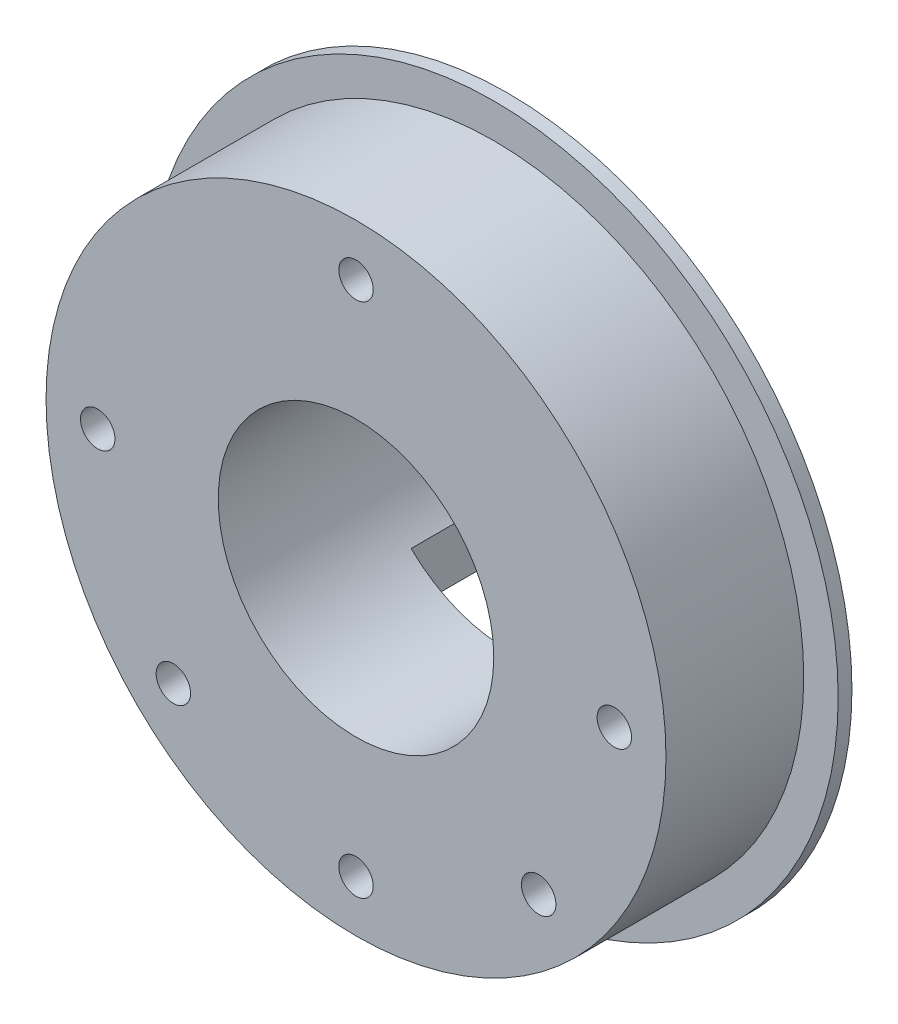
ISO-10303-21;
HEADER;
FILE_DESCRIPTION(('STEP AP214'),'2;1');
FILE_NAME('part.step','',(''),(''),'','','');
FILE_SCHEMA(('AUTOMOTIVE_DESIGN { 1 0 10303 214 1 1 1 1 }'));
ENDSEC;
DATA;
#1=APPLICATION_CONTEXT('core data for automotive mechanical design processes');
#2=APPLICATION_PROTOCOL_DEFINITION('international standard','automotive_design',2000,#1);
#3=PRODUCT_CONTEXT('',#1,'mechanical');
#4=PRODUCT('Part','Part','',(#3));
#5=PRODUCT_RELATED_PRODUCT_CATEGORY('part','',(#4));
#6=PRODUCT_DEFINITION_FORMATION('','',#4);
#7=PRODUCT_DEFINITION_CONTEXT('part definition',#1,'design');
#8=PRODUCT_DEFINITION('design','',#6,#7);
#9=PRODUCT_DEFINITION_SHAPE('','',#8);
#10=(LENGTH_UNIT() NAMED_UNIT(*) SI_UNIT(.MILLI.,.METRE.));
#11=(NAMED_UNIT(*) PLANE_ANGLE_UNIT() SI_UNIT($,.RADIAN.));
#12=(NAMED_UNIT(*) SI_UNIT($,.STERADIAN.) SOLID_ANGLE_UNIT());
#13=UNCERTAINTY_MEASURE_WITH_UNIT(LENGTH_MEASURE(1.E-05),#10,'distance_accuracy_value','');
#14=(GEOMETRIC_REPRESENTATION_CONTEXT(3) GLOBAL_UNCERTAINTY_ASSIGNED_CONTEXT((#13)) GLOBAL_UNIT_ASSIGNED_CONTEXT((#10,
#11,#12)) REPRESENTATION_CONTEXT('',''));
#15=CARTESIAN_POINT('',(0.,0.,0.));
#16=DIRECTION('',(0.,0.,1.));
#17=DIRECTION('',(1.,0.,0.));
#18=AXIS2_PLACEMENT_3D('',#15,#16,#17);
#19=CARTESIAN_POINT('',(0.,0.,8.));
#20=DIRECTION('',(0.,0.,1.));
#21=DIRECTION('',(1.,0.,0.));
#22=AXIS2_PLACEMENT_3D('',#19,#20,#21);
#23=PLANE('',#22);
#24=CARTESIAN_POINT('',(0.,0.,8.));
#25=DIRECTION('',(0.,0.,1.));
#26=DIRECTION('',(1.,0.,0.));
#27=AXIS2_PLACEMENT_3D('',#24,#25,#26);
#28=CIRCLE('',#27,22.5);
#29=CARTESIAN_POINT('',(22.5,0.,8.));
#30=VERTEX_POINT('',#29);
#31=EDGE_CURVE('E122',#30,#30,#28,.T.);
#32=ORIENTED_EDGE('',*,*,#31,.F.);
#33=EDGE_LOOP('',(#32));
#34=FACE_BOUND('',#33,.T.);
#35=CARTESIAN_POINT('',(0.,0.,8.));
#36=DIRECTION('',(0.,0.,1.));
#37=DIRECTION('',(1.,0.,0.));
#38=AXIS2_PLACEMENT_3D('',#35,#36,#37);
#39=CIRCLE('',#38,25.);
#40=CARTESIAN_POINT('',(25.,0.,8.));
#41=VERTEX_POINT('',#40);
#42=EDGE_CURVE('E260',#41,#41,#39,.T.);
#43=ORIENTED_EDGE('',*,*,#42,.T.);
#44=EDGE_LOOP('',(#43));
#45=FACE_BOUND('',#44,.T.);
#46=ADVANCED_FACE('F41',(#34,#45),#23,.T.);
#47=CARTESIAN_POINT('',(0.,0.,7.));
#48=DIRECTION('',(0.,0.,1.));
#49=DIRECTION('',(1.,0.,0.));
#50=AXIS2_PLACEMENT_3D('',#47,#48,#49);
#51=PLANE('',#50);
#52=DIRECTION('',(0.,1.,0.));
#53=VECTOR('',#52,1.);
#54=CARTESIAN_POINT('',(7.,-25.,7.));
#55=LINE('',#54,#53);
#56=CARTESIAN_POINT('',(7.,-10.9544511501033,7.));
#57=VERTEX_POINT('',#56);
#58=CARTESIAN_POINT('',(7.,-7.14142842854285,7.));
#59=VERTEX_POINT('',#58);
#60=EDGE_CURVE('E189',#57,#59,#55,.T.);
#61=ORIENTED_EDGE('',*,*,#60,.F.);
#62=CARTESIAN_POINT('',(0.,0.,7.));
#63=DIRECTION('',(0.,0.,1.));
#64=DIRECTION('',(1.,0.,0.));
#65=AXIS2_PLACEMENT_3D('',#62,#63,#64);
#66=CIRCLE('',#65,13.);
#67=CARTESIAN_POINT('',(7.,10.9544511501033,7.));
#68=VERTEX_POINT('',#67);
#69=EDGE_CURVE('E263',#57,#68,#66,.T.);
#70=ORIENTED_EDGE('',*,*,#69,.T.);
#71=CARTESIAN_POINT('',(7.,7.14142842854285,7.));
#72=VERTEX_POINT('',#71);
#73=EDGE_CURVE('E176',#72,#68,#55,.T.);
#74=ORIENTED_EDGE('',*,*,#73,.F.);
#75=CARTESIAN_POINT('',(0.,0.,7.));
#76=DIRECTION('',(0.,0.,1.));
#77=DIRECTION('',(1.,0.,0.));
#78=AXIS2_PLACEMENT_3D('',#75,#76,#77);
#79=CIRCLE('',#78,10.);
#80=CARTESIAN_POINT('',(-7.,7.14142842854285,7.));
#81=VERTEX_POINT('',#80);
#82=EDGE_CURVE('E49',#72,#81,#79,.T.);
#83=ORIENTED_EDGE('',*,*,#82,.T.);
#84=DIRECTION('',(0.,1.,0.));
#85=VECTOR('',#84,1.);
#86=CARTESIAN_POINT('',(-7.,-25.,7.));
#87=LINE('',#86,#85);
#88=CARTESIAN_POINT('',(-7.,10.9544511501033,7.));
#89=VERTEX_POINT('',#88);
#90=EDGE_CURVE('E109',#81,#89,#87,.T.);
#91=ORIENTED_EDGE('',*,*,#90,.T.);
#92=CARTESIAN_POINT('',(-7.,-10.9544511501033,7.));
#93=VERTEX_POINT('',#92);
#94=EDGE_CURVE('E265',#89,#93,#66,.T.);
#95=ORIENTED_EDGE('',*,*,#94,.T.);
#96=CARTESIAN_POINT('',(-7.,-7.14142842854285,7.));
#97=VERTEX_POINT('',#96);
#98=EDGE_CURVE('E180',#93,#97,#87,.T.);
#99=ORIENTED_EDGE('',*,*,#98,.T.);
#100=EDGE_CURVE('E121',#97,#59,#79,.T.);
#101=ORIENTED_EDGE('',*,*,#100,.T.);
#102=EDGE_LOOP('',(#61,#70,#74,#83,#91,#95,#99,#101));
#103=FACE_BOUND('',#102,.T.);
#104=CARTESIAN_POINT('',(0.,0.,7.));
#105=DIRECTION('',(0.,0.,1.));
#106=DIRECTION('',(1.,0.,0.));
#107=AXIS2_PLACEMENT_3D('',#104,#105,#106);
#108=CIRCLE('',#107,25.);
#109=CARTESIAN_POINT('',(25.,0.,7.));
#110=VERTEX_POINT('',#109);
#111=EDGE_CURVE('E258',#110,#110,#108,.T.);
#112=ORIENTED_EDGE('',*,*,#111,.F.);
#113=EDGE_LOOP('',(#112));
#114=FACE_BOUND('',#113,.T.);
#115=ADVANCED_FACE('F171',(#103,#114),#51,.F.);
#116=CARTESIAN_POINT('',(0.,0.,8.));
#117=DIRECTION('',(0.,0.,-1.));
#118=DIRECTION('',(-1.,0.,0.));
#119=AXIS2_PLACEMENT_3D('',#116,#117,#118);
#120=CYLINDRICAL_SURFACE('',#119,25.);
#121=ORIENTED_EDGE('',*,*,#42,.F.);
#122=EDGE_LOOP('',(#121));
#123=FACE_BOUND('',#122,.T.);
#124=ORIENTED_EDGE('',*,*,#111,.T.);
#125=EDGE_LOOP('',(#124));
#126=FACE_BOUND('',#125,.T.);
#127=ADVANCED_FACE('F273',(#123,#126),#120,.T.);
#128=CARTESIAN_POINT('',(0.,0.,0.));
#129=DIRECTION('',(0.,0.,1.));
#130=DIRECTION('',(1.,0.,0.));
#131=AXIS2_PLACEMENT_3D('',#128,#129,#130);
#132=PLANE('',#131);
#133=CARTESIAN_POINT('',(0.,7.,0.));
#134=DIRECTION('',(0.,0.,-1.));
#135=DIRECTION('',(-1.,0.,0.));
#136=AXIS2_PLACEMENT_3D('',#133,#134,#135);
#137=CIRCLE('',#136,1.);
#138=CARTESIAN_POINT('',(-1.,7.,0.));
#139=VERTEX_POINT('',#138);
#140=EDGE_CURVE('E141',#139,#139,#137,.T.);
#141=ORIENTED_EDGE('',*,*,#140,.F.);
#142=EDGE_LOOP('',(#141));
#143=FACE_BOUND('',#142,.T.);
#144=CARTESIAN_POINT('',(0.,0.,0.));
#145=DIRECTION('',(0.,0.,-1.));
#146=DIRECTION('',(-1.,0.,0.));
#147=AXIS2_PLACEMENT_3D('',#144,#145,#146);
#148=CIRCLE('',#147,3.);
#149=CARTESIAN_POINT('',(-3.,0.,0.));
#150=VERTEX_POINT('',#149);
#151=EDGE_CURVE('E201',#150,#150,#148,.T.);
#152=ORIENTED_EDGE('',*,*,#151,.F.);
#153=EDGE_LOOP('',(#152));
#154=FACE_BOUND('',#153,.T.);
#155=CARTESIAN_POINT('',(0.,-7.,0.));
#156=DIRECTION('',(0.,0.,-1.));
#157=DIRECTION('',(-1.,0.,0.));
#158=AXIS2_PLACEMENT_3D('',#155,#156,#157);
#159=CIRCLE('',#158,1.);
#160=CARTESIAN_POINT('',(-1.,-7.,0.));
#161=VERTEX_POINT('',#160);
#162=EDGE_CURVE('E204',#161,#161,#159,.T.);
#163=ORIENTED_EDGE('',*,*,#162,.F.);
#164=EDGE_LOOP('',(#163));
#165=FACE_BOUND('',#164,.T.);
#166=CARTESIAN_POINT('',(7.,3.,0.));
#167=DIRECTION('',(0.,0.,-1.));
#168=DIRECTION('',(-1.,0.,0.));
#169=AXIS2_PLACEMENT_3D('',#166,#167,#168);
#170=CIRCLE('',#169,1.);
#171=CARTESIAN_POINT('',(6.,3.,0.));
#172=VERTEX_POINT('',#171);
#173=EDGE_CURVE('E207',#172,#172,#170,.T.);
#174=ORIENTED_EDGE('',*,*,#173,.F.);
#175=EDGE_LOOP('',(#174));
#176=FACE_BOUND('',#175,.T.);
#177=CARTESIAN_POINT('',(7.,-3.,0.));
#178=DIRECTION('',(0.,0.,-1.));
#179=DIRECTION('',(-1.,0.,0.));
#180=AXIS2_PLACEMENT_3D('',#177,#178,#179);
#181=CIRCLE('',#180,1.);
#182=CARTESIAN_POINT('',(6.,-3.,0.));
#183=VERTEX_POINT('',#182);
#184=EDGE_CURVE('E210',#183,#183,#181,.T.);
#185=ORIENTED_EDGE('',*,*,#184,.F.);
#186=EDGE_LOOP('',(#185));
#187=FACE_BOUND('',#186,.T.);
#188=CARTESIAN_POINT('',(-7.,3.,0.));
#189=DIRECTION('',(0.,0.,-1.));
#190=DIRECTION('',(-1.,0.,0.));
#191=AXIS2_PLACEMENT_3D('',#188,#189,#190);
#192=CIRCLE('',#191,1.);
#193=CARTESIAN_POINT('',(-8.,3.,0.));
#194=VERTEX_POINT('',#193);
#195=EDGE_CURVE('E213',#194,#194,#192,.T.);
#196=ORIENTED_EDGE('',*,*,#195,.F.);
#197=EDGE_LOOP('',(#196));
#198=FACE_BOUND('',#197,.T.);
#199=CARTESIAN_POINT('',(-7.,-3.,0.));
#200=DIRECTION('',(0.,0.,-1.));
#201=DIRECTION('',(-1.,0.,0.));
#202=AXIS2_PLACEMENT_3D('',#199,#200,#201);
#203=CIRCLE('',#202,1.);
#204=CARTESIAN_POINT('',(-8.,-3.,0.));
#205=VERTEX_POINT('',#204);
#206=EDGE_CURVE('E198',#205,#205,#203,.T.);
#207=ORIENTED_EDGE('',*,*,#206,.F.);
#208=EDGE_LOOP('',(#207));
#209=FACE_BOUND('',#208,.T.);
#210=CARTESIAN_POINT('',(0.,0.,0.));
#211=DIRECTION('',(0.,0.,1.));
#212=DIRECTION('',(1.,0.,0.));
#213=AXIS2_PLACEMENT_3D('',#210,#211,#212);
#214=CIRCLE('',#213,13.);
#215=CARTESIAN_POINT('',(13.,0.,0.));
#216=VERTEX_POINT('',#215);
#217=EDGE_CURVE('E133',#216,#216,#214,.T.);
#218=ORIENTED_EDGE('',*,*,#217,.F.);
#219=EDGE_LOOP('',(#218));
#220=FACE_BOUND('',#219,.T.);
#221=ADVANCED_FACE('F271',(#143,#154,#165,#176,#187,#198,#209,#220),#132,.F.);
#222=CARTESIAN_POINT('',(0.,0.,2.));
#223=DIRECTION('',(0.,0.,-1.));
#224=DIRECTION('',(-1.,0.,0.));
#225=AXIS2_PLACEMENT_3D('',#222,#223,#224);
#226=CYLINDRICAL_SURFACE('',#225,13.);
#227=CARTESIAN_POINT('',(0.,0.,2.));
#228=DIRECTION('',(0.,0.,-1.));
#229=DIRECTION('',(-1.,0.,0.));
#230=AXIS2_PLACEMENT_3D('',#227,#228,#229);
#231=CIRCLE('',#230,13.);
#232=CARTESIAN_POINT('',(-7.,10.9544511501033,2.));
#233=VERTEX_POINT('',#232);
#234=CARTESIAN_POINT('',(7.,10.9544511501033,2.));
#235=VERTEX_POINT('',#234);
#236=EDGE_CURVE('E188',#233,#235,#231,.T.);
#237=ORIENTED_EDGE('',*,*,#236,.T.);
#238=DIRECTION('',(0.,0.,-1.));
#239=VECTOR('',#238,1.);
#240=CARTESIAN_POINT('',(7.,10.9544511501033,2.));
#241=LINE('',#240,#239);
#242=EDGE_CURVE('E192',#235,#68,#241,.F.);
#243=ORIENTED_EDGE('',*,*,#242,.T.);
#244=ORIENTED_EDGE('',*,*,#69,.F.);
#245=DIRECTION('',(0.,0.,-1.));
#246=VECTOR('',#245,1.);
#247=CARTESIAN_POINT('',(7.,-10.9544511501033,2.));
#248=LINE('',#247,#246);
#249=CARTESIAN_POINT('',(7.,-10.9544511501033,2.));
#250=VERTEX_POINT('',#249);
#251=EDGE_CURVE('E195',#57,#250,#248,.T.);
#252=ORIENTED_EDGE('',*,*,#251,.T.);
#253=CARTESIAN_POINT('',(-7.,-10.9544511501033,2.));
#254=VERTEX_POINT('',#253);
#255=EDGE_CURVE('E186',#250,#254,#231,.T.);
#256=ORIENTED_EDGE('',*,*,#255,.T.);
#257=DIRECTION('',(0.,0.,-1.));
#258=VECTOR('',#257,1.);
#259=CARTESIAN_POINT('',(-7.,-10.9544511501033,2.));
#260=LINE('',#259,#258);
#261=EDGE_CURVE('E107',#254,#93,#260,.F.);
#262=ORIENTED_EDGE('',*,*,#261,.T.);
#263=ORIENTED_EDGE('',*,*,#94,.F.);
#264=DIRECTION('',(0.,0.,-1.));
#265=VECTOR('',#264,1.);
#266=CARTESIAN_POINT('',(-7.,10.9544511501033,2.));
#267=LINE('',#266,#265);
#268=EDGE_CURVE('E179',#89,#233,#267,.T.);
#269=ORIENTED_EDGE('',*,*,#268,.T.);
#270=EDGE_LOOP('',(#237,#243,#244,#252,#256,#262,#263,#269));
#271=FACE_BOUND('',#270,.T.);
#272=ORIENTED_EDGE('',*,*,#217,.T.);
#273=EDGE_LOOP('',(#272));
#274=FACE_BOUND('',#273,.T.);
#275=ADVANCED_FACE('F43',(#271,#274),#226,.T.);
#276=CARTESIAN_POINT('',(0.,0.,18.));
#277=DIRECTION('',(0.,0.,1.));
#278=DIRECTION('',(1.,0.,0.));
#279=AXIS2_PLACEMENT_3D('',#276,#277,#278);
#280=PLANE('',#279);
#281=CARTESIAN_POINT('',(0.,18.75,18.));
#282=DIRECTION('',(0.,0.,1.));
#283=DIRECTION('',(1.,0.,0.));
#284=AXIS2_PLACEMENT_3D('',#281,#282,#283);
#285=CIRCLE('',#284,1.25);
#286=CARTESIAN_POINT('',(1.25,18.75,18.));
#287=VERTEX_POINT('',#286);
#288=EDGE_CURVE('E222',#287,#287,#285,.T.);
#289=ORIENTED_EDGE('',*,*,#288,.F.);
#290=EDGE_LOOP('',(#289));
#291=FACE_BOUND('',#290,.T.);
#292=CARTESIAN_POINT('',(18.75,0.,18.));
#293=DIRECTION('',(0.,0.,1.));
#294=DIRECTION('',(1.,0.,0.));
#295=AXIS2_PLACEMENT_3D('',#292,#293,#294);
#296=CIRCLE('',#295,1.25);
#297=CARTESIAN_POINT('',(20.,0.,18.));
#298=VERTEX_POINT('',#297);
#299=EDGE_CURVE('E225',#298,#298,#296,.T.);
#300=ORIENTED_EDGE('',*,*,#299,.F.);
#301=EDGE_LOOP('',(#300));
#302=FACE_BOUND('',#301,.T.);
#303=CARTESIAN_POINT('',(13.2582521472477,-13.2582521472478,18.));
#304=DIRECTION('',(0.,0.,1.));
#305=DIRECTION('',(1.,0.,0.));
#306=AXIS2_PLACEMENT_3D('',#303,#304,#305);
#307=CIRCLE('',#306,1.25);
#308=CARTESIAN_POINT('',(14.5082521472477,-13.2582521472478,18.));
#309=VERTEX_POINT('',#308);
#310=EDGE_CURVE('E231',#309,#309,#307,.T.);
#311=ORIENTED_EDGE('',*,*,#310,.F.);
#312=EDGE_LOOP('',(#311));
#313=FACE_BOUND('',#312,.T.);
#314=CARTESIAN_POINT('',(-1.30930550206618E-13,-18.75,18.));
#315=DIRECTION('',(0.,0.,1.));
#316=DIRECTION('',(1.,0.,0.));
#317=AXIS2_PLACEMENT_3D('',#314,#315,#316);
#318=CIRCLE('',#317,1.25);
#319=CARTESIAN_POINT('',(1.24999999999987,-18.75,18.));
#320=VERTEX_POINT('',#319);
#321=EDGE_CURVE('E237',#320,#320,#318,.T.);
#322=ORIENTED_EDGE('',*,*,#321,.F.);
#323=EDGE_LOOP('',(#322));
#324=FACE_BOUND('',#323,.T.);
#325=CARTESIAN_POINT('',(-13.2582521472479,-13.2582521472477,18.));
#326=DIRECTION('',(0.,0.,1.));
#327=DIRECTION('',(1.,0.,0.));
#328=AXIS2_PLACEMENT_3D('',#325,#326,#327);
#329=CIRCLE('',#328,1.25);
#330=CARTESIAN_POINT('',(-12.0082521472479,-13.2582521472477,18.));
#331=VERTEX_POINT('',#330);
#332=EDGE_CURVE('E243',#331,#331,#329,.T.);
#333=ORIENTED_EDGE('',*,*,#332,.F.);
#334=EDGE_LOOP('',(#333));
#335=FACE_BOUND('',#334,.T.);
#336=CARTESIAN_POINT('',(-18.75,1.96395825309926E-13,18.));
#337=DIRECTION('',(0.,0.,1.));
#338=DIRECTION('',(1.,0.,0.));
#339=AXIS2_PLACEMENT_3D('',#336,#337,#338);
#340=CIRCLE('',#339,1.25);
#341=CARTESIAN_POINT('',(-17.5,1.96395825309926E-13,18.));
#342=VERTEX_POINT('',#341);
#343=EDGE_CURVE('E249',#342,#342,#340,.T.);
#344=ORIENTED_EDGE('',*,*,#343,.F.);
#345=EDGE_LOOP('',(#344));
#346=FACE_BOUND('',#345,.T.);
#347=CARTESIAN_POINT('',(0.,0.,18.));
#348=DIRECTION('',(0.,0.,1.));
#349=DIRECTION('',(1.,0.,0.));
#350=AXIS2_PLACEMENT_3D('',#347,#348,#349);
#351=CIRCLE('',#350,22.5);
#352=CARTESIAN_POINT('',(22.5,0.,18.));
#353=VERTEX_POINT('',#352);
#354=EDGE_CURVE('E256',#353,#353,#351,.T.);
#355=ORIENTED_EDGE('',*,*,#354,.T.);
#356=EDGE_LOOP('',(#355));
#357=FACE_BOUND('',#356,.T.);
#358=CARTESIAN_POINT('',(0.,0.,18.));
#359=DIRECTION('',(0.,0.,1.));
#360=DIRECTION('',(1.,0.,0.));
#361=AXIS2_PLACEMENT_3D('',#358,#359,#360);
#362=CIRCLE('',#361,10.);
#363=CARTESIAN_POINT('',(10.,0.,18.));
#364=VERTEX_POINT('',#363);
#365=EDGE_CURVE('E221',#364,#364,#362,.T.);
#366=ORIENTED_EDGE('',*,*,#365,.F.);
#367=EDGE_LOOP('',(#366));
#368=FACE_BOUND('',#367,.T.);
#369=ADVANCED_FACE('F280',(#291,#302,#313,#324,#335,#346,#357,#368),#280,.T.);
#370=CARTESIAN_POINT('',(0.,0.,18.));
#371=DIRECTION('',(0.,0.,-1.));
#372=DIRECTION('',(-1.,0.,0.));
#373=AXIS2_PLACEMENT_3D('',#370,#371,#372);
#374=CYLINDRICAL_SURFACE('',#373,22.5);
#375=ORIENTED_EDGE('',*,*,#354,.F.);
#376=EDGE_LOOP('',(#375));
#377=FACE_BOUND('',#376,.T.);
#378=ORIENTED_EDGE('',*,*,#31,.T.);
#379=EDGE_LOOP('',(#378));
#380=FACE_BOUND('',#379,.T.);
#381=ADVANCED_FACE('F299',(#377,#380),#374,.T.);
#382=CARTESIAN_POINT('',(0.,0.,2.));
#383=DIRECTION('',(0.,0.,1.));
#384=DIRECTION('',(1.,0.,0.));
#385=AXIS2_PLACEMENT_3D('',#382,#383,#384);
#386=PLANE('',#385);
#387=CARTESIAN_POINT('',(7.,-3.,2.));
#388=DIRECTION('',(0.,0.,1.));
#389=DIRECTION('',(1.,0.,0.));
#390=AXIS2_PLACEMENT_3D('',#387,#388,#389);
#391=CIRCLE('',#390,1.);
#392=CARTESIAN_POINT('',(8.,-3.,2.));
#393=VERTEX_POINT('',#392);
#394=EDGE_CURVE('E144',#393,#393,#391,.T.);
#395=ORIENTED_EDGE('',*,*,#394,.F.);
#396=EDGE_LOOP('',(#395));
#397=FACE_BOUND('',#396,.T.);
#398=CARTESIAN_POINT('',(7.,3.,2.));
#399=DIRECTION('',(0.,0.,1.));
#400=DIRECTION('',(1.,0.,0.));
#401=AXIS2_PLACEMENT_3D('',#398,#399,#400);
#402=CIRCLE('',#401,1.);
#403=CARTESIAN_POINT('',(8.,3.,2.));
#404=VERTEX_POINT('',#403);
#405=EDGE_CURVE('E147',#404,#404,#402,.T.);
#406=ORIENTED_EDGE('',*,*,#405,.F.);
#407=EDGE_LOOP('',(#406));
#408=FACE_BOUND('',#407,.T.);
#409=CARTESIAN_POINT('',(-7.,3.,2.));
#410=DIRECTION('',(0.,0.,1.));
#411=DIRECTION('',(1.,0.,0.));
#412=AXIS2_PLACEMENT_3D('',#409,#410,#411);
#413=CIRCLE('',#412,1.);
#414=CARTESIAN_POINT('',(-6.,3.,2.));
#415=VERTEX_POINT('',#414);
#416=EDGE_CURVE('E140',#415,#415,#413,.T.);
#417=ORIENTED_EDGE('',*,*,#416,.F.);
#418=EDGE_LOOP('',(#417));
#419=FACE_BOUND('',#418,.T.);
#420=CARTESIAN_POINT('',(-7.,-3.,2.));
#421=DIRECTION('',(0.,0.,1.));
#422=DIRECTION('',(1.,0.,0.));
#423=AXIS2_PLACEMENT_3D('',#420,#421,#422);
#424=CIRCLE('',#423,1.);
#425=CARTESIAN_POINT('',(-6.,-3.,2.));
#426=VERTEX_POINT('',#425);
#427=EDGE_CURVE('E137',#426,#426,#424,.T.);
#428=ORIENTED_EDGE('',*,*,#427,.F.);
#429=EDGE_LOOP('',(#428));
#430=FACE_BOUND('',#429,.T.);
#431=DIRECTION('',(0.,1.,0.));
#432=VECTOR('',#431,1.);
#433=CARTESIAN_POINT('',(-7.,-25.,2.));
#434=LINE('',#433,#432);
#435=CARTESIAN_POINT('',(-7.,7.14142842854285,2.));
#436=VERTEX_POINT('',#435);
#437=EDGE_CURVE('E110',#436,#233,#434,.T.);
#438=ORIENTED_EDGE('',*,*,#437,.F.);
#439=CARTESIAN_POINT('',(0.,0.,2.));
#440=DIRECTION('',(0.,0.,1.));
#441=DIRECTION('',(1.,0.,0.));
#442=AXIS2_PLACEMENT_3D('',#439,#440,#441);
#443=CIRCLE('',#442,10.);
#444=CARTESIAN_POINT('',(-7.,-7.14142842854285,2.));
#445=VERTEX_POINT('',#444);
#446=EDGE_CURVE('E119',#445,#436,#443,.F.);
#447=ORIENTED_EDGE('',*,*,#446,.F.);
#448=EDGE_CURVE('E63',#254,#445,#434,.T.);
#449=ORIENTED_EDGE('',*,*,#448,.F.);
#450=ORIENTED_EDGE('',*,*,#255,.F.);
#451=DIRECTION('',(0.,1.,0.));
#452=VECTOR('',#451,1.);
#453=CARTESIAN_POINT('',(7.,-25.,2.));
#454=LINE('',#453,#452);
#455=CARTESIAN_POINT('',(7.,-7.14142842854285,2.));
#456=VERTEX_POINT('',#455);
#457=EDGE_CURVE('E184',#250,#456,#454,.T.);
#458=ORIENTED_EDGE('',*,*,#457,.T.);
#459=CARTESIAN_POINT('',(7.,7.14142842854285,2.));
#460=VERTEX_POINT('',#459);
#461=EDGE_CURVE('E128',#460,#456,#443,.F.);
#462=ORIENTED_EDGE('',*,*,#461,.F.);
#463=EDGE_CURVE('E56',#460,#235,#454,.T.);
#464=ORIENTED_EDGE('',*,*,#463,.T.);
#465=ORIENTED_EDGE('',*,*,#236,.F.);
#466=EDGE_LOOP('',(#438,#447,#449,#450,#458,#462,#464,#465));
#467=FACE_BOUND('',#466,.T.);
#468=CARTESIAN_POINT('',(0.,7.,2.));
#469=DIRECTION('',(0.,0.,1.));
#470=DIRECTION('',(1.,0.,0.));
#471=AXIS2_PLACEMENT_3D('',#468,#469,#470);
#472=CIRCLE('',#471,1.);
#473=CARTESIAN_POINT('',(1.,7.,2.));
#474=VERTEX_POINT('',#473);
#475=EDGE_CURVE('E156',#474,#474,#472,.T.);
#476=ORIENTED_EDGE('',*,*,#475,.F.);
#477=EDGE_LOOP('',(#476));
#478=FACE_BOUND('',#477,.T.);
#479=CARTESIAN_POINT('',(0.,0.,2.));
#480=DIRECTION('',(0.,0.,1.));
#481=DIRECTION('',(1.,0.,0.));
#482=AXIS2_PLACEMENT_3D('',#479,#480,#481);
#483=CIRCLE('',#482,3.);
#484=CARTESIAN_POINT('',(3.,0.,2.));
#485=VERTEX_POINT('',#484);
#486=EDGE_CURVE('E153',#485,#485,#483,.T.);
#487=ORIENTED_EDGE('',*,*,#486,.F.);
#488=EDGE_LOOP('',(#487));
#489=FACE_BOUND('',#488,.T.);
#490=CARTESIAN_POINT('',(0.,-7.,2.));
#491=DIRECTION('',(0.,0.,1.));
#492=DIRECTION('',(1.,0.,0.));
#493=AXIS2_PLACEMENT_3D('',#490,#491,#492);
#494=CIRCLE('',#493,1.);
#495=CARTESIAN_POINT('',(1.,-7.,2.));
#496=VERTEX_POINT('',#495);
#497=EDGE_CURVE('E150',#496,#496,#494,.T.);
#498=ORIENTED_EDGE('',*,*,#497,.F.);
#499=EDGE_LOOP('',(#498));
#500=FACE_BOUND('',#499,.T.);
#501=ADVANCED_FACE('F124',(#397,#408,#419,#430,#467,#478,#489,#500),#386,.T.);
#502=CARTESIAN_POINT('',(0.,0.,7.));
#503=DIRECTION('',(0.,0.,-1.));
#504=DIRECTION('',(-1.,0.,0.));
#505=AXIS2_PLACEMENT_3D('',#502,#503,#504);
#506=CYLINDRICAL_SURFACE('',#505,10.);
#507=DIRECTION('',(0.,0.,-1.));
#508=VECTOR('',#507,1.);
#509=CARTESIAN_POINT('',(7.,7.14142842854285,7.));
#510=LINE('',#509,#508);
#511=EDGE_CURVE('E11',#460,#72,#510,.F.);
#512=ORIENTED_EDGE('',*,*,#511,.F.);
#513=ORIENTED_EDGE('',*,*,#461,.T.);
#514=DIRECTION('',(0.,0.,-1.));
#515=VECTOR('',#514,1.);
#516=CARTESIAN_POINT('',(7.,-7.14142842854285,7.));
#517=LINE('',#516,#515);
#518=EDGE_CURVE('E161',#59,#456,#517,.T.);
#519=ORIENTED_EDGE('',*,*,#518,.F.);
#520=ORIENTED_EDGE('',*,*,#100,.F.);
#521=DIRECTION('',(0.,0.,-1.));
#522=VECTOR('',#521,1.);
#523=CARTESIAN_POINT('',(-7.,-7.14142842854285,7.));
#524=LINE('',#523,#522);
#525=EDGE_CURVE('E104',#445,#97,#524,.F.);
#526=ORIENTED_EDGE('',*,*,#525,.F.);
#527=ORIENTED_EDGE('',*,*,#446,.T.);
#528=DIRECTION('',(0.,0.,-1.));
#529=VECTOR('',#528,1.);
#530=CARTESIAN_POINT('',(-7.,7.14142842854285,7.));
#531=LINE('',#530,#529);
#532=EDGE_CURVE('E163',#81,#436,#531,.T.);
#533=ORIENTED_EDGE('',*,*,#532,.F.);
#534=ORIENTED_EDGE('',*,*,#82,.F.);
#535=EDGE_LOOP('',(#512,#513,#519,#520,#526,#527,#533,#534));
#536=FACE_BOUND('',#535,.T.);
#537=ORIENTED_EDGE('',*,*,#365,.T.);
#538=EDGE_LOOP('',(#537));
#539=FACE_BOUND('',#538,.T.);
#540=ADVANCED_FACE('F116',(#536,#539),#506,.F.);
#541=CARTESIAN_POINT('',(-18.75,1.96395825309926E-13,10.));
#542=DIRECTION('',(0.,0.,1.));
#543=DIRECTION('',(1.,0.,0.));
#544=AXIS2_PLACEMENT_3D('',#541,#542,#543);
#545=CYLINDRICAL_SURFACE('',#544,1.25);
#546=CARTESIAN_POINT('',(-18.75,1.96395825309926E-13,10.));
#547=DIRECTION('',(0.,0.,1.));
#548=DIRECTION('',(1.,0.,0.));
#549=AXIS2_PLACEMENT_3D('',#546,#547,#548);
#550=CIRCLE('',#549,1.25);
#551=CARTESIAN_POINT('',(-17.5,1.96395825309926E-13,10.));
#552=VERTEX_POINT('',#551);
#553=EDGE_CURVE('E158',#552,#552,#550,.T.);
#554=ORIENTED_EDGE('',*,*,#553,.F.);
#555=EDGE_LOOP('',(#554));
#556=FACE_BOUND('',#555,.T.);
#557=ORIENTED_EDGE('',*,*,#343,.T.);
#558=EDGE_LOOP('',(#557));
#559=FACE_BOUND('',#558,.T.);
#560=ADVANCED_FACE('F303',(#556,#559),#545,.F.);
#561=CARTESIAN_POINT('',(-18.75,1.96395825309926E-13,10.));
#562=DIRECTION('',(0.,0.,1.));
#563=DIRECTION('',(1.,0.,0.));
#564=AXIS2_PLACEMENT_3D('',#561,#562,#563);
#565=PLANE('',#564);
#566=ORIENTED_EDGE('',*,*,#553,.T.);
#567=EDGE_LOOP('',(#566));
#568=FACE_BOUND('',#567,.T.);
#569=ADVANCED_FACE('F367',(#568),#565,.T.);
#570=CARTESIAN_POINT('',(-13.2582521472479,-13.2582521472477,10.));
#571=DIRECTION('',(0.,0.,1.));
#572=DIRECTION('',(1.,0.,0.));
#573=AXIS2_PLACEMENT_3D('',#570,#571,#572);
#574=CYLINDRICAL_SURFACE('',#573,1.25);
#575=CARTESIAN_POINT('',(-13.2582521472479,-13.2582521472477,10.));
#576=DIRECTION('',(0.,0.,1.));
#577=DIRECTION('',(1.,0.,0.));
#578=AXIS2_PLACEMENT_3D('',#575,#576,#577);
#579=CIRCLE('',#578,1.25);
#580=CARTESIAN_POINT('',(-12.0082521472479,-13.2582521472477,10.));
#581=VERTEX_POINT('',#580);
#582=EDGE_CURVE('E246',#581,#581,#579,.T.);
#583=ORIENTED_EDGE('',*,*,#582,.F.);
#584=EDGE_LOOP('',(#583));
#585=FACE_BOUND('',#584,.T.);
#586=ORIENTED_EDGE('',*,*,#332,.T.);
#587=EDGE_LOOP('',(#586));
#588=FACE_BOUND('',#587,.T.);
#589=ADVANCED_FACE('F364',(#585,#588),#574,.F.);
#590=CARTESIAN_POINT('',(-13.2582521472479,-13.2582521472477,10.));
#591=DIRECTION('',(0.,0.,1.));
#592=DIRECTION('',(1.,0.,0.));
#593=AXIS2_PLACEMENT_3D('',#590,#591,#592);
#594=PLANE('',#593);
#595=ORIENTED_EDGE('',*,*,#582,.T.);
#596=EDGE_LOOP('',(#595));
#597=FACE_BOUND('',#596,.T.);
#598=ADVANCED_FACE('F359',(#597),#594,.T.);
#599=CARTESIAN_POINT('',(-1.30930550206618E-13,-18.75,10.));
#600=DIRECTION('',(0.,0.,1.));
#601=DIRECTION('',(1.,0.,0.));
#602=AXIS2_PLACEMENT_3D('',#599,#600,#601);
#603=CYLINDRICAL_SURFACE('',#602,1.25);
#604=CARTESIAN_POINT('',(-1.30930550206618E-13,-18.75,10.));
#605=DIRECTION('',(0.,0.,1.));
#606=DIRECTION('',(1.,0.,0.));
#607=AXIS2_PLACEMENT_3D('',#604,#605,#606);
#608=CIRCLE('',#607,1.25);
#609=CARTESIAN_POINT('',(1.24999999999987,-18.75,10.));
#610=VERTEX_POINT('',#609);
#611=EDGE_CURVE('E240',#610,#610,#608,.T.);
#612=ORIENTED_EDGE('',*,*,#611,.F.);
#613=EDGE_LOOP('',(#612));
#614=FACE_BOUND('',#613,.T.);
#615=ORIENTED_EDGE('',*,*,#321,.T.);
#616=EDGE_LOOP('',(#615));
#617=FACE_BOUND('',#616,.T.);
#618=ADVANCED_FACE('F356',(#614,#617),#603,.F.);
#619=CARTESIAN_POINT('',(-1.30930550206618E-13,-18.75,10.));
#620=DIRECTION('',(0.,0.,1.));
#621=DIRECTION('',(1.,0.,0.));
#622=AXIS2_PLACEMENT_3D('',#619,#620,#621);
#623=PLANE('',#622);
#624=ORIENTED_EDGE('',*,*,#611,.T.);
#625=EDGE_LOOP('',(#624));
#626=FACE_BOUND('',#625,.T.);
#627=ADVANCED_FACE('F351',(#626),#623,.T.);
#628=CARTESIAN_POINT('',(13.2582521472477,-13.2582521472478,10.));
#629=DIRECTION('',(0.,0.,1.));
#630=DIRECTION('',(1.,0.,0.));
#631=AXIS2_PLACEMENT_3D('',#628,#629,#630);
#632=CYLINDRICAL_SURFACE('',#631,1.25);
#633=CARTESIAN_POINT('',(13.2582521472477,-13.2582521472478,10.));
#634=DIRECTION('',(0.,0.,1.));
#635=DIRECTION('',(1.,0.,0.));
#636=AXIS2_PLACEMENT_3D('',#633,#634,#635);
#637=CIRCLE('',#636,1.25);
#638=CARTESIAN_POINT('',(14.5082521472477,-13.2582521472478,10.));
#639=VERTEX_POINT('',#638);
#640=EDGE_CURVE('E234',#639,#639,#637,.T.);
#641=ORIENTED_EDGE('',*,*,#640,.F.);
#642=EDGE_LOOP('',(#641));
#643=FACE_BOUND('',#642,.T.);
#644=ORIENTED_EDGE('',*,*,#310,.T.);
#645=EDGE_LOOP('',(#644));
#646=FACE_BOUND('',#645,.T.);
#647=ADVANCED_FACE('F348',(#643,#646),#632,.F.);
#648=CARTESIAN_POINT('',(13.2582521472477,-13.2582521472478,10.));
#649=DIRECTION('',(0.,0.,1.));
#650=DIRECTION('',(1.,0.,0.));
#651=AXIS2_PLACEMENT_3D('',#648,#649,#650);
#652=PLANE('',#651);
#653=ORIENTED_EDGE('',*,*,#640,.T.);
#654=EDGE_LOOP('',(#653));
#655=FACE_BOUND('',#654,.T.);
#656=ADVANCED_FACE('F343',(#655),#652,.T.);
#657=CARTESIAN_POINT('',(18.75,0.,10.));
#658=DIRECTION('',(0.,0.,1.));
#659=DIRECTION('',(1.,0.,0.));
#660=AXIS2_PLACEMENT_3D('',#657,#658,#659);
#661=CYLINDRICAL_SURFACE('',#660,1.25);
#662=CARTESIAN_POINT('',(18.75,0.,10.));
#663=DIRECTION('',(0.,0.,1.));
#664=DIRECTION('',(1.,0.,0.));
#665=AXIS2_PLACEMENT_3D('',#662,#663,#664);
#666=CIRCLE('',#665,1.25);
#667=CARTESIAN_POINT('',(20.,0.,10.));
#668=VERTEX_POINT('',#667);
#669=EDGE_CURVE('E228',#668,#668,#666,.T.);
#670=ORIENTED_EDGE('',*,*,#669,.F.);
#671=EDGE_LOOP('',(#670));
#672=FACE_BOUND('',#671,.T.);
#673=ORIENTED_EDGE('',*,*,#299,.T.);
#674=EDGE_LOOP('',(#673));
#675=FACE_BOUND('',#674,.T.);
#676=ADVANCED_FACE('F340',(#672,#675),#661,.F.);
#677=CARTESIAN_POINT('',(18.75,0.,10.));
#678=DIRECTION('',(0.,0.,1.));
#679=DIRECTION('',(1.,0.,0.));
#680=AXIS2_PLACEMENT_3D('',#677,#678,#679);
#681=PLANE('',#680);
#682=ORIENTED_EDGE('',*,*,#669,.T.);
#683=EDGE_LOOP('',(#682));
#684=FACE_BOUND('',#683,.T.);
#685=ADVANCED_FACE('F338',(#684),#681,.T.);
#686=CARTESIAN_POINT('',(0.,18.75,10.));
#687=DIRECTION('',(0.,0.,1.));
#688=DIRECTION('',(1.,0.,0.));
#689=AXIS2_PLACEMENT_3D('',#686,#687,#688);
#690=CYLINDRICAL_SURFACE('',#689,1.25);
#691=CARTESIAN_POINT('',(0.,18.75,10.));
#692=DIRECTION('',(0.,0.,1.));
#693=DIRECTION('',(1.,0.,0.));
#694=AXIS2_PLACEMENT_3D('',#691,#692,#693);
#695=CIRCLE('',#694,1.25);
#696=CARTESIAN_POINT('',(1.25,18.75,10.));
#697=VERTEX_POINT('',#696);
#698=EDGE_CURVE('E218',#697,#697,#695,.T.);
#699=ORIENTED_EDGE('',*,*,#698,.F.);
#700=EDGE_LOOP('',(#699));
#701=FACE_BOUND('',#700,.T.);
#702=ORIENTED_EDGE('',*,*,#288,.T.);
#703=EDGE_LOOP('',(#702));
#704=FACE_BOUND('',#703,.T.);
#705=ADVANCED_FACE('F331',(#701,#704),#690,.F.);
#706=CARTESIAN_POINT('',(0.,18.75,10.));
#707=DIRECTION('',(0.,0.,1.));
#708=DIRECTION('',(1.,0.,0.));
#709=AXIS2_PLACEMENT_3D('',#706,#707,#708);
#710=PLANE('',#709);
#711=ORIENTED_EDGE('',*,*,#698,.T.);
#712=EDGE_LOOP('',(#711));
#713=FACE_BOUND('',#712,.T.);
#714=ADVANCED_FACE('F321',(#713),#710,.T.);
#715=CARTESIAN_POINT('',(-7.,-3.,18.));
#716=DIRECTION('',(0.,0.,-1.));
#717=DIRECTION('',(-1.,0.,0.));
#718=AXIS2_PLACEMENT_3D('',#715,#716,#717);
#719=CYLINDRICAL_SURFACE('',#718,1.);
#720=ORIENTED_EDGE('',*,*,#427,.T.);
#721=EDGE_LOOP('',(#720));
#722=FACE_BOUND('',#721,.T.);
#723=ORIENTED_EDGE('',*,*,#206,.T.);
#724=EDGE_LOOP('',(#723));
#725=FACE_BOUND('',#724,.T.);
#726=ADVANCED_FACE('F317',(#722,#725),#719,.F.);
#727=CARTESIAN_POINT('',(-7.,3.,18.));
#728=DIRECTION('',(0.,0.,-1.));
#729=DIRECTION('',(-1.,0.,0.));
#730=AXIS2_PLACEMENT_3D('',#727,#728,#729);
#731=CYLINDRICAL_SURFACE('',#730,1.);
#732=ORIENTED_EDGE('',*,*,#416,.T.);
#733=EDGE_LOOP('',(#732));
#734=FACE_BOUND('',#733,.T.);
#735=ORIENTED_EDGE('',*,*,#195,.T.);
#736=EDGE_LOOP('',(#735));
#737=FACE_BOUND('',#736,.T.);
#738=ADVANCED_FACE('F320',(#734,#737),#731,.F.);
#739=CARTESIAN_POINT('',(7.,-3.,18.));
#740=DIRECTION('',(0.,0.,-1.));
#741=DIRECTION('',(-1.,0.,0.));
#742=AXIS2_PLACEMENT_3D('',#739,#740,#741);
#743=CYLINDRICAL_SURFACE('',#742,1.);
#744=ORIENTED_EDGE('',*,*,#394,.T.);
#745=EDGE_LOOP('',(#744));
#746=FACE_BOUND('',#745,.T.);
#747=ORIENTED_EDGE('',*,*,#184,.T.);
#748=EDGE_LOOP('',(#747));
#749=FACE_BOUND('',#748,.T.);
#750=ADVANCED_FACE('F328',(#746,#749),#743,.F.);
#751=CARTESIAN_POINT('',(7.,3.,18.));
#752=DIRECTION('',(0.,0.,-1.));
#753=DIRECTION('',(-1.,0.,0.));
#754=AXIS2_PLACEMENT_3D('',#751,#752,#753);
#755=CYLINDRICAL_SURFACE('',#754,1.);
#756=ORIENTED_EDGE('',*,*,#405,.T.);
#757=EDGE_LOOP('',(#756));
#758=FACE_BOUND('',#757,.T.);
#759=ORIENTED_EDGE('',*,*,#173,.T.);
#760=EDGE_LOOP('',(#759));
#761=FACE_BOUND('',#760,.T.);
#762=ADVANCED_FACE('F487',(#758,#761),#755,.F.);
#763=CARTESIAN_POINT('',(0.,-7.,18.));
#764=DIRECTION('',(0.,0.,-1.));
#765=DIRECTION('',(-1.,0.,0.));
#766=AXIS2_PLACEMENT_3D('',#763,#764,#765);
#767=CYLINDRICAL_SURFACE('',#766,1.);
#768=ORIENTED_EDGE('',*,*,#497,.T.);
#769=EDGE_LOOP('',(#768));
#770=FACE_BOUND('',#769,.T.);
#771=ORIENTED_EDGE('',*,*,#162,.T.);
#772=EDGE_LOOP('',(#771));
#773=FACE_BOUND('',#772,.T.);
#774=ADVANCED_FACE('F496',(#770,#773),#767,.F.);
#775=CARTESIAN_POINT('',(0.,0.,18.));
#776=DIRECTION('',(0.,0.,-1.));
#777=DIRECTION('',(-1.,0.,0.));
#778=AXIS2_PLACEMENT_3D('',#775,#776,#777);
#779=CYLINDRICAL_SURFACE('',#778,3.);
#780=ORIENTED_EDGE('',*,*,#486,.T.);
#781=EDGE_LOOP('',(#780));
#782=FACE_BOUND('',#781,.T.);
#783=ORIENTED_EDGE('',*,*,#151,.T.);
#784=EDGE_LOOP('',(#783));
#785=FACE_BOUND('',#784,.T.);
#786=ADVANCED_FACE('F506',(#782,#785),#779,.F.);
#787=CARTESIAN_POINT('',(0.,7.,18.));
#788=DIRECTION('',(0.,0.,-1.));
#789=DIRECTION('',(-1.,0.,0.));
#790=AXIS2_PLACEMENT_3D('',#787,#788,#789);
#791=CYLINDRICAL_SURFACE('',#790,1.);
#792=ORIENTED_EDGE('',*,*,#475,.T.);
#793=EDGE_LOOP('',(#792));
#794=FACE_BOUND('',#793,.T.);
#795=ORIENTED_EDGE('',*,*,#140,.T.);
#796=EDGE_LOOP('',(#795));
#797=FACE_BOUND('',#796,.T.);
#798=ADVANCED_FACE('F516',(#794,#797),#791,.F.);
#799=CARTESIAN_POINT('',(-7.,-25.,2.));
#800=DIRECTION('',(-1.,0.,0.));
#801=DIRECTION('',(0.,0.,1.));
#802=AXIS2_PLACEMENT_3D('',#799,#800,#801);
#803=PLANE('',#802);
#804=ORIENTED_EDGE('',*,*,#448,.T.);
#805=ORIENTED_EDGE('',*,*,#525,.T.);
#806=ORIENTED_EDGE('',*,*,#98,.F.);
#807=ORIENTED_EDGE('',*,*,#261,.F.);
#808=EDGE_LOOP('',(#804,#805,#806,#807));
#809=FACE_BOUND('',#808,.T.);
#810=ADVANCED_FACE('F103',(#809),#803,.F.);
#811=CARTESIAN_POINT('',(7.,-25.,2.));
#812=DIRECTION('',(1.,0.,0.));
#813=DIRECTION('',(0.,0.,-1.));
#814=AXIS2_PLACEMENT_3D('',#811,#812,#813);
#815=PLANE('',#814);
#816=ORIENTED_EDGE('',*,*,#60,.T.);
#817=ORIENTED_EDGE('',*,*,#518,.T.);
#818=ORIENTED_EDGE('',*,*,#457,.F.);
#819=ORIENTED_EDGE('',*,*,#251,.F.);
#820=EDGE_LOOP('',(#816,#817,#818,#819));
#821=FACE_BOUND('',#820,.T.);
#822=ADVANCED_FACE('F549',(#821),#815,.F.);
#823=ORIENTED_EDGE('',*,*,#463,.F.);
#824=ORIENTED_EDGE('',*,*,#511,.T.);
#825=ORIENTED_EDGE('',*,*,#73,.T.);
#826=ORIENTED_EDGE('',*,*,#242,.F.);
#827=EDGE_LOOP('',(#823,#824,#825,#826));
#828=FACE_BOUND('',#827,.T.);
#829=ADVANCED_FACE('F558',(#828),#815,.F.);
#830=ORIENTED_EDGE('',*,*,#90,.F.);
#831=ORIENTED_EDGE('',*,*,#532,.T.);
#832=ORIENTED_EDGE('',*,*,#437,.T.);
#833=ORIENTED_EDGE('',*,*,#268,.F.);
#834=EDGE_LOOP('',(#830,#831,#832,#833));
#835=FACE_BOUND('',#834,.T.);
#836=ADVANCED_FACE('F177',(#835),#803,.F.);
#837=CLOSED_SHELL('',(#46,#115,#127,#221,#275,#369,#381,#501,#540,#560,#569,#589,#598,#618,#627,
#647,#656,#676,#685,#705,#714,#726,#738,#750,#762,#774,#786,#798,#810,#822,#829,#836));
#838=MANIFOLD_SOLID_BREP('B2',#837);
#839=ADVANCED_BREP_SHAPE_REPRESENTATION('',(#18,#838),#14);
#840=SHAPE_DEFINITION_REPRESENTATION(#9,#839);
ENDSEC;
END-ISO-10303-21;
